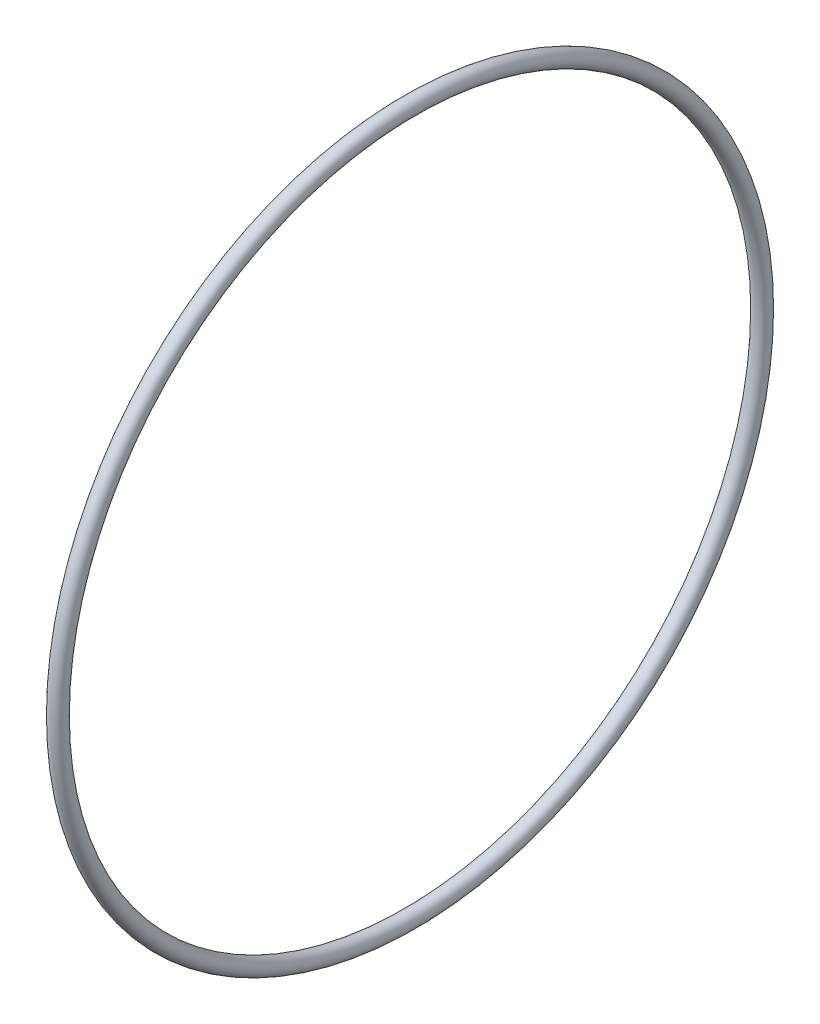
ISO-10303-21;
HEADER;
FILE_DESCRIPTION(('STEP AP214'),'2;1');
FILE_NAME('part.step','',(''),(''),'','','');
FILE_SCHEMA(('AUTOMOTIVE_DESIGN { 1 0 10303 214 1 1 1 1 }'));
ENDSEC;
DATA;
#1=APPLICATION_CONTEXT('core data for automotive mechanical design processes');
#2=APPLICATION_PROTOCOL_DEFINITION('international standard','automotive_design',2000,#1);
#3=PRODUCT_CONTEXT('',#1,'mechanical');
#4=PRODUCT('Part','Part','',(#3));
#5=PRODUCT_RELATED_PRODUCT_CATEGORY('part','',(#4));
#6=PRODUCT_DEFINITION_FORMATION('','',#4);
#7=PRODUCT_DEFINITION_CONTEXT('part definition',#1,'design');
#8=PRODUCT_DEFINITION('design','',#6,#7);
#9=PRODUCT_DEFINITION_SHAPE('','',#8);
#10=(LENGTH_UNIT() NAMED_UNIT(*) SI_UNIT(.MILLI.,.METRE.));
#11=(NAMED_UNIT(*) PLANE_ANGLE_UNIT() SI_UNIT($,.RADIAN.));
#12=(NAMED_UNIT(*) SI_UNIT($,.STERADIAN.) SOLID_ANGLE_UNIT());
#13=UNCERTAINTY_MEASURE_WITH_UNIT(LENGTH_MEASURE(1.E-05),#10,'distance_accuracy_value','');
#14=(GEOMETRIC_REPRESENTATION_CONTEXT(3) GLOBAL_UNCERTAINTY_ASSIGNED_CONTEXT((#13)) GLOBAL_UNIT_ASSIGNED_CONTEXT((#10,
#11,#12)) REPRESENTATION_CONTEXT('',''));
#15=CARTESIAN_POINT('',(0.,0.,0.));
#16=DIRECTION('',(0.,0.,1.));
#17=DIRECTION('',(1.,0.,0.));
#18=AXIS2_PLACEMENT_3D('',#15,#16,#17);
#19=CARTESIAN_POINT('',(0.,0.,0.));
#20=DIRECTION('',(1.,0.,0.));
#21=DIRECTION('',(0.,0.,-1.));
#22=AXIS2_PLACEMENT_3D('',#19,#20,#21);
#23=TOROIDAL_SURFACE('',#22,43.5,1.);
#24=CARTESIAN_POINT('',(0.,0.,-44.5));
#25=VERTEX_POINT('',#24);
#26=VERTEX_LOOP('',#25);
#27=FACE_BOUND('',#26,.T.);
#28=ADVANCED_FACE('F35',(#27),#23,.T.);
#29=CLOSED_SHELL('',(#28));
#30=MANIFOLD_SOLID_BREP('B2',#29);
#31=ADVANCED_BREP_SHAPE_REPRESENTATION('',(#18,#30),#14);
#32=SHAPE_DEFINITION_REPRESENTATION(#9,#31);
ENDSEC;
END-ISO-10303-21;
